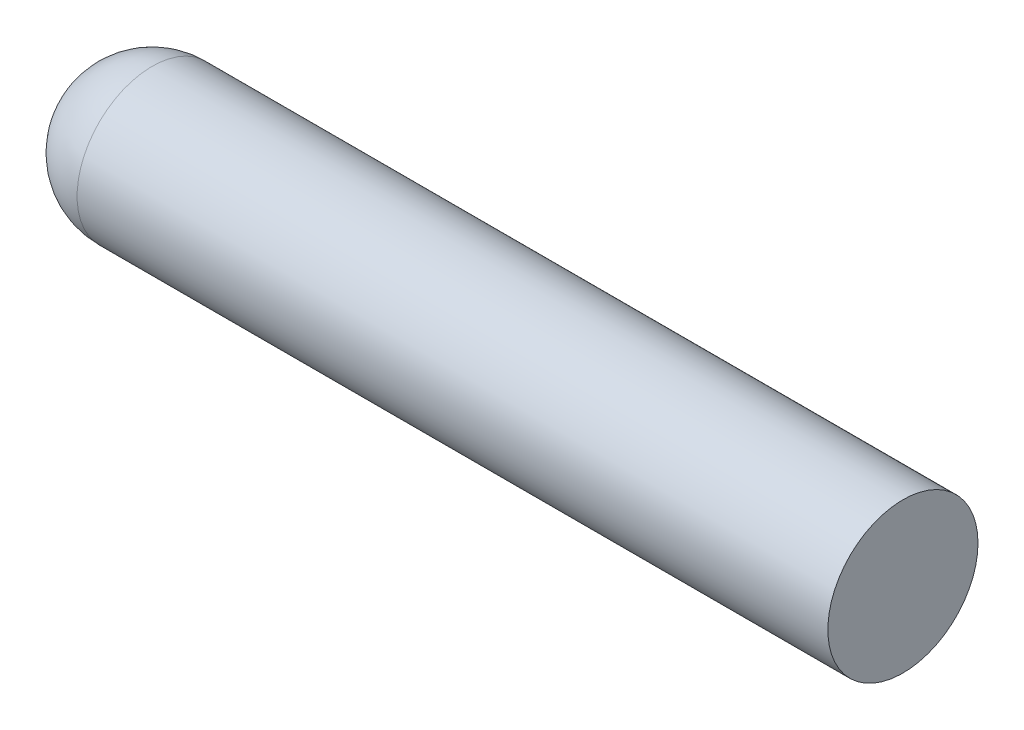
ISO-10303-21;
HEADER;
FILE_DESCRIPTION(('STEP AP214'),'2;1');
FILE_NAME('part.step','',(''),(''),'','','');
FILE_SCHEMA(('AUTOMOTIVE_DESIGN { 1 0 10303 214 1 1 1 1 }'));
ENDSEC;
DATA;
#1=APPLICATION_CONTEXT('core data for automotive mechanical design processes');
#2=APPLICATION_PROTOCOL_DEFINITION('international standard','automotive_design',2000,#1);
#3=PRODUCT_CONTEXT('',#1,'mechanical');
#4=PRODUCT('Part','Part','',(#3));
#5=PRODUCT_RELATED_PRODUCT_CATEGORY('part','',(#4));
#6=PRODUCT_DEFINITION_FORMATION('','',#4);
#7=PRODUCT_DEFINITION_CONTEXT('part definition',#1,'design');
#8=PRODUCT_DEFINITION('design','',#6,#7);
#9=PRODUCT_DEFINITION_SHAPE('','',#8);
#10=(LENGTH_UNIT() NAMED_UNIT(*) SI_UNIT(.MILLI.,.METRE.));
#11=(NAMED_UNIT(*) PLANE_ANGLE_UNIT() SI_UNIT($,.RADIAN.));
#12=(NAMED_UNIT(*) SI_UNIT($,.STERADIAN.) SOLID_ANGLE_UNIT());
#13=UNCERTAINTY_MEASURE_WITH_UNIT(LENGTH_MEASURE(1.E-05),#10,'distance_accuracy_value','');
#14=(GEOMETRIC_REPRESENTATION_CONTEXT(3) GLOBAL_UNCERTAINTY_ASSIGNED_CONTEXT((#13)) GLOBAL_UNIT_ASSIGNED_CONTEXT((#10,
#11,#12)) REPRESENTATION_CONTEXT('',''));
#15=CARTESIAN_POINT('',(0.,0.,0.));
#16=DIRECTION('',(0.,0.,1.));
#17=DIRECTION('',(1.,0.,0.));
#18=AXIS2_PLACEMENT_3D('',#15,#16,#17);
#19=CARTESIAN_POINT('',(0.,0.,-2.54));
#20=DIRECTION('',(-1.,0.,0.));
#21=DIRECTION('',(0.,0.,1.));
#22=AXIS2_PLACEMENT_3D('',#19,#20,#21);
#23=PLANE('',#22);
#24=CARTESIAN_POINT('',(0.,0.,-2.54));
#25=DIRECTION('',(1.,0.,0.));
#26=DIRECTION('',(0.,0.,-1.));
#27=AXIS2_PLACEMENT_3D('',#24,#25,#26);
#28=CIRCLE('',#27,2.54);
#29=CARTESIAN_POINT('',(0.,0.,-5.08));
#30=VERTEX_POINT('',#29);
#31=EDGE_CURVE('E47',#30,#30,#28,.T.);
#32=ORIENTED_EDGE('',*,*,#31,.T.);
#33=EDGE_LOOP('',(#32));
#34=FACE_BOUND('',#33,.T.);
#35=ADVANCED_FACE('F41',(#34),#23,.F.);
#36=CARTESIAN_POINT('',(-25.4,0.,-2.54));
#37=DIRECTION('',(1.,0.,0.));
#38=DIRECTION('',(0.,0.,-1.));
#39=AXIS2_PLACEMENT_3D('',#36,#37,#38);
#40=SPHERICAL_SURFACE('',#39,2.54);
#41=CARTESIAN_POINT('',(-25.4,0.,-2.54));
#42=DIRECTION('',(1.,0.,0.));
#43=DIRECTION('',(0.,0.,-1.));
#44=AXIS2_PLACEMENT_3D('',#41,#42,#43);
#45=CIRCLE('',#44,2.54);
#46=CARTESIAN_POINT('',(-25.4,0.,-5.08));
#47=VERTEX_POINT('',#46);
#48=EDGE_CURVE('E10',#47,#47,#45,.T.);
#49=ORIENTED_EDGE('',*,*,#48,.F.);
#50=EDGE_LOOP('',(#49));
#51=FACE_BOUND('',#50,.T.);
#52=ADVANCED_FACE('F56',(#51),#40,.T.);
#53=CARTESIAN_POINT('',(0.,0.,-2.54));
#54=DIRECTION('',(1.,0.,0.));
#55=DIRECTION('',(0.,0.,-1.));
#56=AXIS2_PLACEMENT_3D('',#53,#54,#55);
#57=CYLINDRICAL_SURFACE('',#56,2.54);
#58=ORIENTED_EDGE('',*,*,#31,.F.);
#59=EDGE_LOOP('',(#58));
#60=FACE_BOUND('',#59,.T.);
#61=ORIENTED_EDGE('',*,*,#48,.T.);
#62=EDGE_LOOP('',(#61));
#63=FACE_BOUND('',#62,.T.);
#64=ADVANCED_FACE('F54',(#60,#63),#57,.T.);
#65=CLOSED_SHELL('',(#35,#52,#64));
#66=MANIFOLD_SOLID_BREP('B2',#65);
#67=ADVANCED_BREP_SHAPE_REPRESENTATION('',(#18,#66),#14);
#68=SHAPE_DEFINITION_REPRESENTATION(#9,#67);
ENDSEC;
END-ISO-10303-21;
